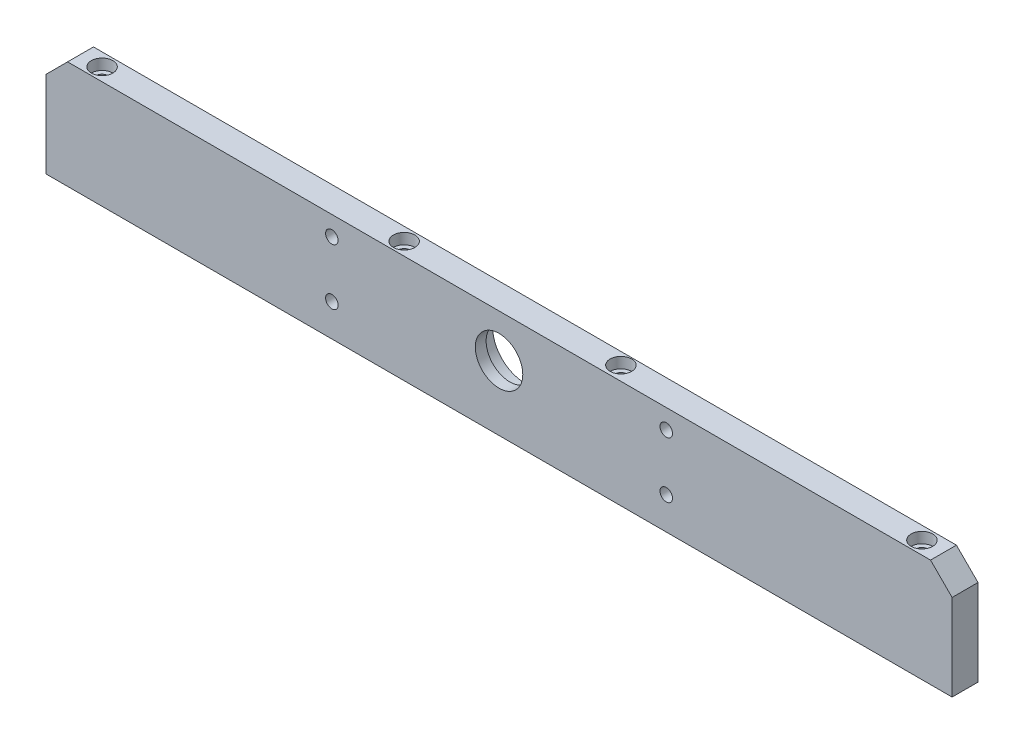
ISO-10303-21;
HEADER;
FILE_DESCRIPTION(('STEP AP214'),'2;1');
FILE_NAME('part.step','',(''),(''),'','','');
FILE_SCHEMA(('AUTOMOTIVE_DESIGN { 1 0 10303 214 1 1 1 1 }'));
ENDSEC;
DATA;
#1=APPLICATION_CONTEXT('core data for automotive mechanical design processes');
#2=APPLICATION_PROTOCOL_DEFINITION('international standard','automotive_design',2000,#1);
#3=PRODUCT_CONTEXT('',#1,'mechanical');
#4=PRODUCT('Part','Part','',(#3));
#5=PRODUCT_RELATED_PRODUCT_CATEGORY('part','',(#4));
#6=PRODUCT_DEFINITION_FORMATION('','',#4);
#7=PRODUCT_DEFINITION_CONTEXT('part definition',#1,'design');
#8=PRODUCT_DEFINITION('design','',#6,#7);
#9=PRODUCT_DEFINITION_SHAPE('','',#8);
#10=(LENGTH_UNIT() NAMED_UNIT(*) SI_UNIT(.MILLI.,.METRE.));
#11=(NAMED_UNIT(*) PLANE_ANGLE_UNIT() SI_UNIT($,.RADIAN.));
#12=(NAMED_UNIT(*) SI_UNIT($,.STERADIAN.) SOLID_ANGLE_UNIT());
#13=UNCERTAINTY_MEASURE_WITH_UNIT(LENGTH_MEASURE(1.E-05),#10,'distance_accuracy_value','');
#14=(GEOMETRIC_REPRESENTATION_CONTEXT(3) GLOBAL_UNCERTAINTY_ASSIGNED_CONTEXT((#13)) GLOBAL_UNIT_ASSIGNED_CONTEXT((#10,
#11,#12)) REPRESENTATION_CONTEXT('',''));
#15=CARTESIAN_POINT('',(0.,0.,0.));
#16=DIRECTION('',(0.,0.,1.));
#17=DIRECTION('',(1.,0.,0.));
#18=AXIS2_PLACEMENT_3D('',#15,#16,#17);
#19=CARTESIAN_POINT('',(210.,30.,0.));
#20=DIRECTION('',(0.,0.,1.));
#21=DIRECTION('',(1.,0.,0.));
#22=AXIS2_PLACEMENT_3D('',#19,#20,#21);
#23=CYLINDRICAL_SURFACE('',#22,11.);
#24=CARTESIAN_POINT('',(210.,30.,12.));
#25=DIRECTION('',(0.,0.,1.));
#26=DIRECTION('',(1.,0.,0.));
#27=AXIS2_PLACEMENT_3D('',#24,#25,#26);
#28=CIRCLE('',#27,11.);
#29=CARTESIAN_POINT('',(221.,30.,12.));
#30=VERTEX_POINT('',#29);
#31=EDGE_CURVE('E221',#30,#30,#28,.T.);
#32=ORIENTED_EDGE('',*,*,#31,.T.);
#33=EDGE_LOOP('',(#32));
#34=FACE_BOUND('',#33,.T.);
#35=CARTESIAN_POINT('',(210.,30.,7.));
#36=DIRECTION('',(0.,0.,-1.));
#37=DIRECTION('',(-1.,0.,0.));
#38=AXIS2_PLACEMENT_3D('',#35,#36,#37);
#39=CIRCLE('',#38,11.);
#40=CARTESIAN_POINT('',(199.,30.,7.));
#41=VERTEX_POINT('',#40);
#42=EDGE_CURVE('E41',#41,#41,#39,.F.);
#43=ORIENTED_EDGE('',*,*,#42,.F.);
#44=EDGE_LOOP('',(#43));
#45=FACE_BOUND('',#44,.T.);
#46=ADVANCED_FACE('F37',(#34,#45),#23,.F.);
#47=CARTESIAN_POINT('',(0.,0.,12.));
#48=DIRECTION('',(1.,0.,0.));
#49=DIRECTION('',(0.,0.,-1.));
#50=AXIS2_PLACEMENT_3D('',#47,#48,#49);
#51=PLANE('',#50);
#52=DIRECTION('',(0.,-1.,0.));
#53=VECTOR('',#52,1.);
#54=CARTESIAN_POINT('',(0.,0.,12.));
#55=LINE('',#54,#53);
#56=CARTESIAN_POINT('',(0.,40.,12.));
#57=VERTEX_POINT('',#56);
#58=CARTESIAN_POINT('',(0.,0.,12.));
#59=VERTEX_POINT('',#58);
#60=EDGE_CURVE('E225',#57,#59,#55,.T.);
#61=ORIENTED_EDGE('',*,*,#60,.F.);
#62=DIRECTION('',(0.,0.,-1.));
#63=VECTOR('',#62,1.);
#64=CARTESIAN_POINT('',(0.,40.,12.));
#65=LINE('',#64,#63);
#66=CARTESIAN_POINT('',(0.,40.,0.));
#67=VERTEX_POINT('',#66);
#68=EDGE_CURVE('E11',#57,#67,#65,.T.);
#69=ORIENTED_EDGE('',*,*,#68,.T.);
#70=DIRECTION('',(0.,-1.,0.));
#71=VECTOR('',#70,1.);
#72=CARTESIAN_POINT('',(0.,0.,0.));
#73=LINE('',#72,#71);
#74=CARTESIAN_POINT('',(0.,0.,0.));
#75=VERTEX_POINT('',#74);
#76=EDGE_CURVE('E224',#67,#75,#73,.T.);
#77=ORIENTED_EDGE('',*,*,#76,.T.);
#78=DIRECTION('',(0.,0.,-1.));
#79=VECTOR('',#78,1.);
#80=CARTESIAN_POINT('',(0.,0.,12.));
#81=LINE('',#80,#79);
#82=EDGE_CURVE('E244',#59,#75,#81,.T.);
#83=ORIENTED_EDGE('',*,*,#82,.F.);
#84=EDGE_LOOP('',(#61,#69,#77,#83));
#85=FACE_BOUND('',#84,.T.);
#86=ADVANCED_FACE('F280',(#85),#51,.F.);
#87=CARTESIAN_POINT('',(0.,0.,12.));
#88=DIRECTION('',(0.,1.,0.));
#89=DIRECTION('',(0.,0.,1.));
#90=AXIS2_PLACEMENT_3D('',#87,#88,#89);
#91=PLANE('',#90);
#92=CARTESIAN_POINT('',(20.,0.,6.));
#93=DIRECTION('',(0.,1.,0.));
#94=DIRECTION('',(0.,0.,1.));
#95=AXIS2_PLACEMENT_3D('',#92,#93,#94);
#96=CIRCLE('',#95,2.89999999999999);
#97=CARTESIAN_POINT('',(20.,0.,8.89999999999999));
#98=VERTEX_POINT('',#97);
#99=EDGE_CURVE('E176',#98,#98,#96,.T.);
#100=ORIENTED_EDGE('',*,*,#99,.T.);
#101=EDGE_LOOP('',(#100));
#102=FACE_BOUND('',#101,.T.);
#103=CARTESIAN_POINT('',(160.,0.,5.99999999999998));
#104=DIRECTION('',(0.,1.,0.));
#105=DIRECTION('',(0.,0.,1.));
#106=AXIS2_PLACEMENT_3D('',#103,#104,#105);
#107=CIRCLE('',#106,2.89999999999999);
#108=CARTESIAN_POINT('',(160.,0.,8.89999999999997));
#109=VERTEX_POINT('',#108);
#110=EDGE_CURVE('E188',#109,#109,#107,.T.);
#111=ORIENTED_EDGE('',*,*,#110,.T.);
#112=EDGE_LOOP('',(#111));
#113=FACE_BOUND('',#112,.T.);
#114=CARTESIAN_POINT('',(260.,0.,5.52848667820843));
#115=DIRECTION('',(0.,1.,0.));
#116=DIRECTION('',(0.,0.,1.));
#117=AXIS2_PLACEMENT_3D('',#114,#115,#116);
#118=CIRCLE('',#117,2.90000000000001);
#119=CARTESIAN_POINT('',(260.,0.,8.42848667820845));
#120=VERTEX_POINT('',#119);
#121=EDGE_CURVE('E200',#120,#120,#118,.T.);
#122=ORIENTED_EDGE('',*,*,#121,.T.);
#123=EDGE_LOOP('',(#122));
#124=FACE_BOUND('',#123,.T.);
#125=CARTESIAN_POINT('',(400.,0.,5.99999999999995));
#126=DIRECTION('',(0.,1.,0.));
#127=DIRECTION('',(0.,0.,1.));
#128=AXIS2_PLACEMENT_3D('',#125,#126,#127);
#129=CIRCLE('',#128,2.90000000000001);
#130=CARTESIAN_POINT('',(400.,0.,8.89999999999997));
#131=VERTEX_POINT('',#130);
#132=EDGE_CURVE('E212',#131,#131,#129,.T.);
#133=ORIENTED_EDGE('',*,*,#132,.T.);
#134=EDGE_LOOP('',(#133));
#135=FACE_BOUND('',#134,.T.);
#136=DIRECTION('',(1.,0.,0.));
#137=VECTOR('',#136,1.);
#138=CARTESIAN_POINT('',(0.,0.,0.));
#139=LINE('',#138,#137);
#140=CARTESIAN_POINT('',(420.,0.,0.));
#141=VERTEX_POINT('',#140);
#142=EDGE_CURVE('E236',#75,#141,#139,.T.);
#143=ORIENTED_EDGE('',*,*,#142,.T.);
#144=DIRECTION('',(0.,0.,-1.));
#145=VECTOR('',#144,1.);
#146=CARTESIAN_POINT('',(420.,0.,12.));
#147=LINE('',#146,#145);
#148=CARTESIAN_POINT('',(420.,0.,12.));
#149=VERTEX_POINT('',#148);
#150=EDGE_CURVE('E234',#149,#141,#147,.T.);
#151=ORIENTED_EDGE('',*,*,#150,.F.);
#152=DIRECTION('',(1.,0.,0.));
#153=VECTOR('',#152,1.);
#154=CARTESIAN_POINT('',(0.,0.,12.));
#155=LINE('',#154,#153);
#156=EDGE_CURVE('E227',#59,#149,#155,.T.);
#157=ORIENTED_EDGE('',*,*,#156,.F.);
#158=ORIENTED_EDGE('',*,*,#82,.T.);
#159=EDGE_LOOP('',(#143,#151,#157,#158));
#160=FACE_BOUND('',#159,.T.);
#161=ADVANCED_FACE('F276',(#102,#113,#124,#135,#160),#91,.F.);
#162=CARTESIAN_POINT('',(420.,0.,12.));
#163=DIRECTION('',(-1.,0.,0.));
#164=DIRECTION('',(0.,0.,1.));
#165=AXIS2_PLACEMENT_3D('',#162,#163,#164);
#166=PLANE('',#165);
#167=DIRECTION('',(0.,1.,0.));
#168=VECTOR('',#167,1.);
#169=CARTESIAN_POINT('',(420.,0.,0.));
#170=LINE('',#169,#168);
#171=CARTESIAN_POINT('',(420.,39.9999999999999,0.));
#172=VERTEX_POINT('',#171);
#173=EDGE_CURVE('E238',#141,#172,#170,.T.);
#174=ORIENTED_EDGE('',*,*,#173,.T.);
#175=DIRECTION('',(0.,0.,1.));
#176=VECTOR('',#175,1.);
#177=CARTESIAN_POINT('',(420.,39.9999999999999,12.));
#178=LINE('',#177,#176);
#179=CARTESIAN_POINT('',(420.,39.9999999999999,12.));
#180=VERTEX_POINT('',#179);
#181=EDGE_CURVE('E61',#172,#180,#178,.T.);
#182=ORIENTED_EDGE('',*,*,#181,.T.);
#183=DIRECTION('',(0.,1.,0.));
#184=VECTOR('',#183,1.);
#185=CARTESIAN_POINT('',(420.,0.,12.));
#186=LINE('',#185,#184);
#187=EDGE_CURVE('E230',#149,#180,#186,.T.);
#188=ORIENTED_EDGE('',*,*,#187,.F.);
#189=ORIENTED_EDGE('',*,*,#150,.T.);
#190=EDGE_LOOP('',(#174,#182,#188,#189));
#191=FACE_BOUND('',#190,.T.);
#192=ADVANCED_FACE('F272',(#191),#166,.F.);
#193=CARTESIAN_POINT('',(0.,50.,12.));
#194=DIRECTION('',(0.,-1.,0.));
#195=DIRECTION('',(0.,0.,-1.));
#196=AXIS2_PLACEMENT_3D('',#193,#194,#195);
#197=PLANE('',#196);
#198=CARTESIAN_POINT('',(20.,50.,6.));
#199=DIRECTION('',(0.,1.,0.));
#200=DIRECTION('',(0.,0.,1.));
#201=AXIS2_PLACEMENT_3D('',#198,#199,#200);
#202=CIRCLE('',#201,5.);
#203=CARTESIAN_POINT('',(20.,50.,11.));
#204=VERTEX_POINT('',#203);
#205=EDGE_CURVE('E167',#204,#204,#202,.T.);
#206=ORIENTED_EDGE('',*,*,#205,.F.);
#207=EDGE_LOOP('',(#206));
#208=FACE_BOUND('',#207,.T.);
#209=CARTESIAN_POINT('',(160.,50.,5.99999999999998));
#210=DIRECTION('',(0.,1.,0.));
#211=DIRECTION('',(0.,0.,1.));
#212=AXIS2_PLACEMENT_3D('',#209,#210,#211);
#213=CIRCLE('',#212,5.);
#214=CARTESIAN_POINT('',(160.,50.,11.));
#215=VERTEX_POINT('',#214);
#216=EDGE_CURVE('E179',#215,#215,#213,.T.);
#217=ORIENTED_EDGE('',*,*,#216,.F.);
#218=EDGE_LOOP('',(#217));
#219=FACE_BOUND('',#218,.T.);
#220=CARTESIAN_POINT('',(260.,50.,5.52848667820843));
#221=DIRECTION('',(0.,1.,0.));
#222=DIRECTION('',(0.,0.,1.));
#223=AXIS2_PLACEMENT_3D('',#220,#221,#222);
#224=CIRCLE('',#223,5.);
#225=CARTESIAN_POINT('',(260.,50.,10.5284866782084));
#226=VERTEX_POINT('',#225);
#227=EDGE_CURVE('E191',#226,#226,#224,.T.);
#228=ORIENTED_EDGE('',*,*,#227,.F.);
#229=EDGE_LOOP('',(#228));
#230=FACE_BOUND('',#229,.T.);
#231=CARTESIAN_POINT('',(400.,50.,5.99999999999995));
#232=DIRECTION('',(0.,1.,0.));
#233=DIRECTION('',(0.,0.,1.));
#234=AXIS2_PLACEMENT_3D('',#231,#232,#233);
#235=CIRCLE('',#234,5.);
#236=CARTESIAN_POINT('',(400.,50.,11.));
#237=VERTEX_POINT('',#236);
#238=EDGE_CURVE('E203',#237,#237,#235,.T.);
#239=ORIENTED_EDGE('',*,*,#238,.F.);
#240=EDGE_LOOP('',(#239));
#241=FACE_BOUND('',#240,.T.);
#242=DIRECTION('',(-1.,0.,0.));
#243=VECTOR('',#242,1.);
#244=CARTESIAN_POINT('',(0.,50.,12.));
#245=LINE('',#244,#243);
#246=CARTESIAN_POINT('',(410.,50.,12.));
#247=VERTEX_POINT('',#246);
#248=CARTESIAN_POINT('',(10.,50.,12.));
#249=VERTEX_POINT('',#248);
#250=EDGE_CURVE('E232',#247,#249,#245,.T.);
#251=ORIENTED_EDGE('',*,*,#250,.F.);
#252=DIRECTION('',(0.,0.,-1.));
#253=VECTOR('',#252,1.);
#254=CARTESIAN_POINT('',(410.,50.,12.));
#255=LINE('',#254,#253);
#256=CARTESIAN_POINT('',(410.,50.,0.));
#257=VERTEX_POINT('',#256);
#258=EDGE_CURVE('E249',#247,#257,#255,.T.);
#259=ORIENTED_EDGE('',*,*,#258,.T.);
#260=DIRECTION('',(-1.,0.,0.));
#261=VECTOR('',#260,1.);
#262=CARTESIAN_POINT('',(0.,50.,0.));
#263=LINE('',#262,#261);
#264=CARTESIAN_POINT('',(10.,50.,0.));
#265=VERTEX_POINT('',#264);
#266=EDGE_CURVE('E228',#257,#265,#263,.T.);
#267=ORIENTED_EDGE('',*,*,#266,.T.);
#268=DIRECTION('',(0.,0.,1.));
#269=VECTOR('',#268,1.);
#270=CARTESIAN_POINT('',(10.,50.,12.));
#271=LINE('',#270,#269);
#272=EDGE_CURVE('E247',#265,#249,#271,.T.);
#273=ORIENTED_EDGE('',*,*,#272,.T.);
#274=EDGE_LOOP('',(#251,#259,#267,#273));
#275=FACE_BOUND('',#274,.T.);
#276=ADVANCED_FACE('F264',(#208,#219,#230,#241,#275),#197,.F.);
#277=CARTESIAN_POINT('',(0.,50.,12.));
#278=DIRECTION('',(0.,0.,-1.));
#279=DIRECTION('',(-1.,0.,0.));
#280=AXIS2_PLACEMENT_3D('',#277,#278,#279);
#281=PLANE('',#280);
#282=CARTESIAN_POINT('',(287.5,40.9999999999999,12.));
#283=DIRECTION('',(0.,0.,-1.));
#284=DIRECTION('',(-1.,0.,0.));
#285=AXIS2_PLACEMENT_3D('',#282,#283,#284);
#286=CIRCLE('',#285,2.90000000000001);
#287=CARTESIAN_POINT('',(284.6,40.9999999999999,12.));
#288=VERTEX_POINT('',#287);
#289=EDGE_CURVE('E128',#288,#288,#286,.T.);
#290=ORIENTED_EDGE('',*,*,#289,.T.);
#291=EDGE_LOOP('',(#290));
#292=FACE_BOUND('',#291,.T.);
#293=CARTESIAN_POINT('',(287.5,15.,12.));
#294=DIRECTION('',(0.,0.,-1.));
#295=DIRECTION('',(-1.,0.,0.));
#296=AXIS2_PLACEMENT_3D('',#293,#294,#295);
#297=CIRCLE('',#296,2.90000000000001);
#298=CARTESIAN_POINT('',(284.6,15.,12.));
#299=VERTEX_POINT('',#298);
#300=EDGE_CURVE('E140',#299,#299,#297,.T.);
#301=ORIENTED_EDGE('',*,*,#300,.T.);
#302=EDGE_LOOP('',(#301));
#303=FACE_BOUND('',#302,.T.);
#304=CARTESIAN_POINT('',(132.5,40.9999999999999,12.));
#305=DIRECTION('',(0.,0.,-1.));
#306=DIRECTION('',(-1.,0.,0.));
#307=AXIS2_PLACEMENT_3D('',#304,#305,#306);
#308=CIRCLE('',#307,2.89999999999999);
#309=CARTESIAN_POINT('',(129.6,40.9999999999999,12.));
#310=VERTEX_POINT('',#309);
#311=EDGE_CURVE('E152',#310,#310,#308,.T.);
#312=ORIENTED_EDGE('',*,*,#311,.T.);
#313=EDGE_LOOP('',(#312));
#314=FACE_BOUND('',#313,.T.);
#315=CARTESIAN_POINT('',(132.5,15.,12.));
#316=DIRECTION('',(0.,0.,-1.));
#317=DIRECTION('',(-1.,0.,0.));
#318=AXIS2_PLACEMENT_3D('',#315,#316,#317);
#319=CIRCLE('',#318,2.89999999999999);
#320=CARTESIAN_POINT('',(129.6,15.,12.));
#321=VERTEX_POINT('',#320);
#322=EDGE_CURVE('E164',#321,#321,#319,.T.);
#323=ORIENTED_EDGE('',*,*,#322,.T.);
#324=EDGE_LOOP('',(#323));
#325=FACE_BOUND('',#324,.T.);
#326=ORIENTED_EDGE('',*,*,#31,.F.);
#327=EDGE_LOOP('',(#326));
#328=FACE_BOUND('',#327,.T.);
#329=ORIENTED_EDGE('',*,*,#187,.T.);
#330=DIRECTION('',(0.707106781186546,-0.707106781186549,0.));
#331=VECTOR('',#330,1.);
#332=CARTESIAN_POINT('',(410.,50.,12.));
#333=LINE('',#332,#331);
#334=EDGE_CURVE('E46',#180,#247,#333,.F.);
#335=ORIENTED_EDGE('',*,*,#334,.T.);
#336=ORIENTED_EDGE('',*,*,#250,.T.);
#337=DIRECTION('',(0.707106781186549,0.707106781186546,0.));
#338=VECTOR('',#337,1.);
#339=CARTESIAN_POINT('',(0.,40.,12.));
#340=LINE('',#339,#338);
#341=EDGE_CURVE('E53',#249,#57,#340,.F.);
#342=ORIENTED_EDGE('',*,*,#341,.T.);
#343=ORIENTED_EDGE('',*,*,#60,.T.);
#344=ORIENTED_EDGE('',*,*,#156,.T.);
#345=EDGE_LOOP('',(#329,#335,#336,#342,#343,#344));
#346=FACE_BOUND('',#345,.T.);
#347=ADVANCED_FACE('F260',(#292,#303,#314,#325,#328,#346),#281,.F.);
#348=CARTESIAN_POINT('',(0.,50.,0.));
#349=DIRECTION('',(0.,0.,-1.));
#350=DIRECTION('',(-1.,0.,0.));
#351=AXIS2_PLACEMENT_3D('',#348,#349,#350);
#352=PLANE('',#351);
#353=CARTESIAN_POINT('',(243.,25.5,0.));
#354=DIRECTION('',(0.,0.,-1.));
#355=DIRECTION('',(-1.,0.,0.));
#356=AXIS2_PLACEMENT_3D('',#353,#354,#355);
#357=CIRCLE('',#356,1.64999999999998);
#358=CARTESIAN_POINT('',(241.35,25.5,0.));
#359=VERTEX_POINT('',#358);
#360=EDGE_CURVE('E109',#359,#359,#357,.T.);
#361=ORIENTED_EDGE('',*,*,#360,.F.);
#362=EDGE_LOOP('',(#361));
#363=FACE_BOUND('',#362,.T.);
#364=CARTESIAN_POINT('',(243.,10.5,0.));
#365=DIRECTION('',(0.,0.,-1.));
#366=DIRECTION('',(-1.,0.,0.));
#367=AXIS2_PLACEMENT_3D('',#364,#365,#366);
#368=CIRCLE('',#367,1.64999999999998);
#369=CARTESIAN_POINT('',(241.35,10.5,0.));
#370=VERTEX_POINT('',#369);
#371=EDGE_CURVE('E108',#370,#370,#368,.T.);
#372=ORIENTED_EDGE('',*,*,#371,.F.);
#373=EDGE_LOOP('',(#372));
#374=FACE_BOUND('',#373,.T.);
#375=CARTESIAN_POINT('',(287.5,40.9999999999999,0.));
#376=DIRECTION('',(0.,0.,-1.));
#377=DIRECTION('',(-1.,0.,0.));
#378=AXIS2_PLACEMENT_3D('',#375,#376,#377);
#379=CIRCLE('',#378,5.);
#380=CARTESIAN_POINT('',(282.5,40.9999999999999,0.));
#381=VERTEX_POINT('',#380);
#382=EDGE_CURVE('E119',#381,#381,#379,.T.);
#383=ORIENTED_EDGE('',*,*,#382,.F.);
#384=EDGE_LOOP('',(#383));
#385=FACE_BOUND('',#384,.T.);
#386=CARTESIAN_POINT('',(287.5,15.,0.));
#387=DIRECTION('',(0.,0.,-1.));
#388=DIRECTION('',(-1.,0.,0.));
#389=AXIS2_PLACEMENT_3D('',#386,#387,#388);
#390=CIRCLE('',#389,5.);
#391=CARTESIAN_POINT('',(282.5,15.,0.));
#392=VERTEX_POINT('',#391);
#393=EDGE_CURVE('E131',#392,#392,#390,.T.);
#394=ORIENTED_EDGE('',*,*,#393,.F.);
#395=EDGE_LOOP('',(#394));
#396=FACE_BOUND('',#395,.T.);
#397=CARTESIAN_POINT('',(132.5,40.9999999999999,0.));
#398=DIRECTION('',(0.,0.,-1.));
#399=DIRECTION('',(-1.,0.,0.));
#400=AXIS2_PLACEMENT_3D('',#397,#398,#399);
#401=CIRCLE('',#400,5.);
#402=CARTESIAN_POINT('',(127.5,40.9999999999999,0.));
#403=VERTEX_POINT('',#402);
#404=EDGE_CURVE('E143',#403,#403,#401,.T.);
#405=ORIENTED_EDGE('',*,*,#404,.F.);
#406=EDGE_LOOP('',(#405));
#407=FACE_BOUND('',#406,.T.);
#408=CARTESIAN_POINT('',(132.5,15.,0.));
#409=DIRECTION('',(0.,0.,-1.));
#410=DIRECTION('',(-1.,0.,0.));
#411=AXIS2_PLACEMENT_3D('',#408,#409,#410);
#412=CIRCLE('',#411,5.);
#413=CARTESIAN_POINT('',(127.5,15.,0.));
#414=VERTEX_POINT('',#413);
#415=EDGE_CURVE('E155',#414,#414,#412,.T.);
#416=ORIENTED_EDGE('',*,*,#415,.F.);
#417=EDGE_LOOP('',(#416));
#418=FACE_BOUND('',#417,.T.);
#419=CARTESIAN_POINT('',(210.,30.,0.));
#420=DIRECTION('',(0.,0.,-1.));
#421=DIRECTION('',(-1.,0.,0.));
#422=AXIS2_PLACEMENT_3D('',#419,#420,#421);
#423=CIRCLE('',#422,15.);
#424=CARTESIAN_POINT('',(195.,30.,0.));
#425=VERTEX_POINT('',#424);
#426=EDGE_CURVE('E215',#425,#425,#423,.T.);
#427=ORIENTED_EDGE('',*,*,#426,.F.);
#428=EDGE_LOOP('',(#427));
#429=FACE_BOUND('',#428,.T.);
#430=ORIENTED_EDGE('',*,*,#266,.F.);
#431=DIRECTION('',(-0.707106781186546,0.707106781186549,0.));
#432=VECTOR('',#431,1.);
#433=CARTESIAN_POINT('',(205.000000000001,255.,0.));
#434=LINE('',#433,#432);
#435=EDGE_CURVE('E254',#257,#172,#434,.F.);
#436=ORIENTED_EDGE('',*,*,#435,.T.);
#437=ORIENTED_EDGE('',*,*,#173,.F.);
#438=ORIENTED_EDGE('',*,*,#142,.F.);
#439=ORIENTED_EDGE('',*,*,#76,.F.);
#440=DIRECTION('',(-0.707106781186549,-0.707106781186546,0.));
#441=VECTOR('',#440,1.);
#442=CARTESIAN_POINT('',(4.99999999999998,45.,0.));
#443=LINE('',#442,#441);
#444=EDGE_CURVE('E252',#67,#265,#443,.F.);
#445=ORIENTED_EDGE('',*,*,#444,.T.);
#446=EDGE_LOOP('',(#430,#436,#437,#438,#439,#445));
#447=FACE_BOUND('',#446,.T.);
#448=ADVANCED_FACE('F270',(#363,#374,#385,#396,#407,#418,#429,#447),#352,.T.);
#449=CARTESIAN_POINT('',(410.,50.,12.));
#450=DIRECTION('',(-0.707106781186549,-0.707106781186545,0.));
#451=DIRECTION('',(0.707106781186546,-0.707106781186549,0.));
#452=AXIS2_PLACEMENT_3D('',#449,#450,#451);
#453=PLANE('',#452);
#454=ORIENTED_EDGE('',*,*,#334,.F.);
#455=ORIENTED_EDGE('',*,*,#181,.F.);
#456=ORIENTED_EDGE('',*,*,#435,.F.);
#457=ORIENTED_EDGE('',*,*,#258,.F.);
#458=EDGE_LOOP('',(#454,#455,#456,#457));
#459=FACE_BOUND('',#458,.T.);
#460=ADVANCED_FACE('F267',(#459),#453,.F.);
#461=CARTESIAN_POINT('',(0.,40.,12.));
#462=DIRECTION('',(0.707106781186546,-0.707106781186549,0.));
#463=DIRECTION('',(0.707106781186549,0.707106781186546,0.));
#464=AXIS2_PLACEMENT_3D('',#461,#462,#463);
#465=PLANE('',#464);
#466=ORIENTED_EDGE('',*,*,#341,.F.);
#467=ORIENTED_EDGE('',*,*,#272,.F.);
#468=ORIENTED_EDGE('',*,*,#444,.F.);
#469=ORIENTED_EDGE('',*,*,#68,.F.);
#470=EDGE_LOOP('',(#466,#467,#468,#469));
#471=FACE_BOUND('',#470,.T.);
#472=ADVANCED_FACE('F39',(#471),#465,.F.);
#473=CARTESIAN_POINT('',(210.,30.,7.));
#474=DIRECTION('',(0.,0.,-1.));
#475=DIRECTION('',(-1.,0.,0.));
#476=AXIS2_PLACEMENT_3D('',#473,#474,#475);
#477=PLANE('',#476);
#478=CARTESIAN_POINT('',(210.,30.,7.));
#479=DIRECTION('',(0.,0.,-1.));
#480=DIRECTION('',(-1.,0.,0.));
#481=AXIS2_PLACEMENT_3D('',#478,#479,#480);
#482=CIRCLE('',#481,15.);
#483=CARTESIAN_POINT('',(195.,30.,7.));
#484=VERTEX_POINT('',#483);
#485=EDGE_CURVE('E216',#484,#484,#482,.T.);
#486=ORIENTED_EDGE('',*,*,#485,.T.);
#487=EDGE_LOOP('',(#486));
#488=FACE_BOUND('',#487,.T.);
#489=ORIENTED_EDGE('',*,*,#42,.T.);
#490=EDGE_LOOP('',(#489));
#491=FACE_BOUND('',#490,.T.);
#492=ADVANCED_FACE('F284',(#488,#491),#477,.T.);
#493=CARTESIAN_POINT('',(210.,30.,7.));
#494=DIRECTION('',(0.,0.,-1.));
#495=DIRECTION('',(-1.,0.,0.));
#496=AXIS2_PLACEMENT_3D('',#493,#494,#495);
#497=CYLINDRICAL_SURFACE('',#496,15.);
#498=ORIENTED_EDGE('',*,*,#485,.F.);
#499=EDGE_LOOP('',(#498));
#500=FACE_BOUND('',#499,.T.);
#501=ORIENTED_EDGE('',*,*,#426,.T.);
#502=EDGE_LOOP('',(#501));
#503=FACE_BOUND('',#502,.T.);
#504=ADVANCED_FACE('F289',(#500,#503),#497,.F.);
#505=CARTESIAN_POINT('',(400.,50.,5.99999999999995));
#506=DIRECTION('',(0.,1.,0.));
#507=DIRECTION('',(0.,0.,1.));
#508=AXIS2_PLACEMENT_3D('',#505,#506,#507);
#509=CYLINDRICAL_SURFACE('',#508,2.90000000000001);
#510=ORIENTED_EDGE('',*,*,#132,.F.);
#511=EDGE_LOOP('',(#510));
#512=FACE_BOUND('',#511,.T.);
#513=CARTESIAN_POINT('',(400.,45.,5.99999999999995));
#514=DIRECTION('',(0.,1.,0.));
#515=DIRECTION('',(0.,0.,1.));
#516=AXIS2_PLACEMENT_3D('',#513,#514,#515);
#517=CIRCLE('',#516,2.90000000000001);
#518=CARTESIAN_POINT('',(400.,45.,8.89999999999997));
#519=VERTEX_POINT('',#518);
#520=EDGE_CURVE('E209',#519,#519,#517,.T.);
#521=ORIENTED_EDGE('',*,*,#520,.T.);
#522=EDGE_LOOP('',(#521));
#523=FACE_BOUND('',#522,.T.);
#524=ADVANCED_FACE('F326',(#512,#523),#509,.F.);
#525=CARTESIAN_POINT('',(402.9,45.,5.99999999999995));
#526=DIRECTION('',(0.,-1.,0.));
#527=DIRECTION('',(0.,0.,-1.));
#528=AXIS2_PLACEMENT_3D('',#525,#526,#527);
#529=PLANE('',#528);
#530=ORIENTED_EDGE('',*,*,#520,.F.);
#531=EDGE_LOOP('',(#530));
#532=FACE_BOUND('',#531,.T.);
#533=CARTESIAN_POINT('',(400.,45.,5.99999999999995));
#534=DIRECTION('',(0.,1.,0.));
#535=DIRECTION('',(0.,0.,1.));
#536=AXIS2_PLACEMENT_3D('',#533,#534,#535);
#537=CIRCLE('',#536,5.);
#538=CARTESIAN_POINT('',(400.,45.,11.));
#539=VERTEX_POINT('',#538);
#540=EDGE_CURVE('E206',#539,#539,#537,.T.);
#541=ORIENTED_EDGE('',*,*,#540,.T.);
#542=EDGE_LOOP('',(#541));
#543=FACE_BOUND('',#542,.T.);
#544=ADVANCED_FACE('F329',(#532,#543),#529,.F.);
#545=CARTESIAN_POINT('',(400.,50.,5.99999999999995));
#546=DIRECTION('',(0.,1.,0.));
#547=DIRECTION('',(0.,0.,1.));
#548=AXIS2_PLACEMENT_3D('',#545,#546,#547);
#549=CYLINDRICAL_SURFACE('',#548,5.);
#550=ORIENTED_EDGE('',*,*,#540,.F.);
#551=EDGE_LOOP('',(#550));
#552=FACE_BOUND('',#551,.T.);
#553=ORIENTED_EDGE('',*,*,#238,.T.);
#554=EDGE_LOOP('',(#553));
#555=FACE_BOUND('',#554,.T.);
#556=ADVANCED_FACE('F335',(#552,#555),#549,.F.);
#557=CARTESIAN_POINT('',(260.,50.,5.52848667820843));
#558=DIRECTION('',(0.,1.,0.));
#559=DIRECTION('',(0.,0.,1.));
#560=AXIS2_PLACEMENT_3D('',#557,#558,#559);
#561=CYLINDRICAL_SURFACE('',#560,2.90000000000001);
#562=ORIENTED_EDGE('',*,*,#121,.F.);
#563=EDGE_LOOP('',(#562));
#564=FACE_BOUND('',#563,.T.);
#565=CARTESIAN_POINT('',(260.,45.,5.52848667820843));
#566=DIRECTION('',(0.,1.,0.));
#567=DIRECTION('',(0.,0.,1.));
#568=AXIS2_PLACEMENT_3D('',#565,#566,#567);
#569=CIRCLE('',#568,2.90000000000001);
#570=CARTESIAN_POINT('',(260.,45.,8.42848667820845));
#571=VERTEX_POINT('',#570);
#572=EDGE_CURVE('E197',#571,#571,#569,.T.);
#573=ORIENTED_EDGE('',*,*,#572,.T.);
#574=EDGE_LOOP('',(#573));
#575=FACE_BOUND('',#574,.T.);
#576=ADVANCED_FACE('F341',(#564,#575),#561,.F.);
#577=CARTESIAN_POINT('',(262.9,45.,5.52848667820843));
#578=DIRECTION('',(0.,-1.,0.));
#579=DIRECTION('',(0.,0.,-1.));
#580=AXIS2_PLACEMENT_3D('',#577,#578,#579);
#581=PLANE('',#580);
#582=ORIENTED_EDGE('',*,*,#572,.F.);
#583=EDGE_LOOP('',(#582));
#584=FACE_BOUND('',#583,.T.);
#585=CARTESIAN_POINT('',(260.,45.,5.52848667820843));
#586=DIRECTION('',(0.,1.,0.));
#587=DIRECTION('',(0.,0.,1.));
#588=AXIS2_PLACEMENT_3D('',#585,#586,#587);
#589=CIRCLE('',#588,5.);
#590=CARTESIAN_POINT('',(260.,45.,10.5284866782084));
#591=VERTEX_POINT('',#590);
#592=EDGE_CURVE('E194',#591,#591,#589,.T.);
#593=ORIENTED_EDGE('',*,*,#592,.T.);
#594=EDGE_LOOP('',(#593));
#595=FACE_BOUND('',#594,.T.);
#596=ADVANCED_FACE('F348',(#584,#595),#581,.F.);
#597=CARTESIAN_POINT('',(260.,50.,5.52848667820843));
#598=DIRECTION('',(0.,1.,0.));
#599=DIRECTION('',(0.,0.,1.));
#600=AXIS2_PLACEMENT_3D('',#597,#598,#599);
#601=CYLINDRICAL_SURFACE('',#600,5.);
#602=ORIENTED_EDGE('',*,*,#592,.F.);
#603=EDGE_LOOP('',(#602));
#604=FACE_BOUND('',#603,.T.);
#605=ORIENTED_EDGE('',*,*,#227,.T.);
#606=EDGE_LOOP('',(#605));
#607=FACE_BOUND('',#606,.T.);
#608=ADVANCED_FACE('F354',(#604,#607),#601,.F.);
#609=CARTESIAN_POINT('',(160.,50.,5.99999999999998));
#610=DIRECTION('',(0.,1.,0.));
#611=DIRECTION('',(0.,0.,1.));
#612=AXIS2_PLACEMENT_3D('',#609,#610,#611);
#613=CYLINDRICAL_SURFACE('',#612,2.9);
#614=ORIENTED_EDGE('',*,*,#110,.F.);
#615=EDGE_LOOP('',(#614));
#616=FACE_BOUND('',#615,.T.);
#617=CARTESIAN_POINT('',(160.,45.,5.99999999999998));
#618=DIRECTION('',(0.,1.,0.));
#619=DIRECTION('',(0.,0.,1.));
#620=AXIS2_PLACEMENT_3D('',#617,#618,#619);
#621=CIRCLE('',#620,2.90000000000001);
#622=CARTESIAN_POINT('',(160.,45.,8.9));
#623=VERTEX_POINT('',#622);
#624=EDGE_CURVE('E185',#623,#623,#621,.T.);
#625=ORIENTED_EDGE('',*,*,#624,.T.);
#626=EDGE_LOOP('',(#625));
#627=FACE_BOUND('',#626,.T.);
#628=ADVANCED_FACE('F358',(#616,#627),#613,.F.);
#629=CARTESIAN_POINT('',(162.9,45.,5.99999999999998));
#630=DIRECTION('',(0.,-1.,0.));
#631=DIRECTION('',(0.,0.,-1.));
#632=AXIS2_PLACEMENT_3D('',#629,#630,#631);
#633=PLANE('',#632);
#634=ORIENTED_EDGE('',*,*,#624,.F.);
#635=EDGE_LOOP('',(#634));
#636=FACE_BOUND('',#635,.T.);
#637=CARTESIAN_POINT('',(160.,45.,5.99999999999998));
#638=DIRECTION('',(0.,1.,0.));
#639=DIRECTION('',(0.,0.,1.));
#640=AXIS2_PLACEMENT_3D('',#637,#638,#639);
#641=CIRCLE('',#640,5.);
#642=CARTESIAN_POINT('',(160.,45.,11.));
#643=VERTEX_POINT('',#642);
#644=EDGE_CURVE('E182',#643,#643,#641,.T.);
#645=ORIENTED_EDGE('',*,*,#644,.T.);
#646=EDGE_LOOP('',(#645));
#647=FACE_BOUND('',#646,.T.);
#648=ADVANCED_FACE('F362',(#636,#647),#633,.F.);
#649=CARTESIAN_POINT('',(160.,50.,5.99999999999998));
#650=DIRECTION('',(0.,1.,0.));
#651=DIRECTION('',(0.,0.,1.));
#652=AXIS2_PLACEMENT_3D('',#649,#650,#651);
#653=CYLINDRICAL_SURFACE('',#652,5.);
#654=ORIENTED_EDGE('',*,*,#644,.F.);
#655=EDGE_LOOP('',(#654));
#656=FACE_BOUND('',#655,.T.);
#657=ORIENTED_EDGE('',*,*,#216,.T.);
#658=EDGE_LOOP('',(#657));
#659=FACE_BOUND('',#658,.T.);
#660=ADVANCED_FACE('F366',(#656,#659),#653,.F.);
#661=CARTESIAN_POINT('',(20.,50.,6.));
#662=DIRECTION('',(0.,1.,0.));
#663=DIRECTION('',(0.,0.,1.));
#664=AXIS2_PLACEMENT_3D('',#661,#662,#663);
#665=CYLINDRICAL_SURFACE('',#664,2.9);
#666=ORIENTED_EDGE('',*,*,#99,.F.);
#667=EDGE_LOOP('',(#666));
#668=FACE_BOUND('',#667,.T.);
#669=CARTESIAN_POINT('',(20.,45.,6.));
#670=DIRECTION('',(0.,1.,0.));
#671=DIRECTION('',(0.,0.,1.));
#672=AXIS2_PLACEMENT_3D('',#669,#670,#671);
#673=CIRCLE('',#672,2.9);
#674=CARTESIAN_POINT('',(20.,45.,8.9));
#675=VERTEX_POINT('',#674);
#676=EDGE_CURVE('E173',#675,#675,#673,.T.);
#677=ORIENTED_EDGE('',*,*,#676,.T.);
#678=EDGE_LOOP('',(#677));
#679=FACE_BOUND('',#678,.T.);
#680=ADVANCED_FACE('F370',(#668,#679),#665,.F.);
#681=CARTESIAN_POINT('',(22.9,45.,6.));
#682=DIRECTION('',(0.,-1.,0.));
#683=DIRECTION('',(0.,0.,-1.));
#684=AXIS2_PLACEMENT_3D('',#681,#682,#683);
#685=PLANE('',#684);
#686=ORIENTED_EDGE('',*,*,#676,.F.);
#687=EDGE_LOOP('',(#686));
#688=FACE_BOUND('',#687,.T.);
#689=CARTESIAN_POINT('',(20.,45.,6.));
#690=DIRECTION('',(0.,1.,0.));
#691=DIRECTION('',(0.,0.,1.));
#692=AXIS2_PLACEMENT_3D('',#689,#690,#691);
#693=CIRCLE('',#692,5.);
#694=CARTESIAN_POINT('',(20.,45.,11.));
#695=VERTEX_POINT('',#694);
#696=EDGE_CURVE('E170',#695,#695,#693,.T.);
#697=ORIENTED_EDGE('',*,*,#696,.T.);
#698=EDGE_LOOP('',(#697));
#699=FACE_BOUND('',#698,.T.);
#700=ADVANCED_FACE('F374',(#688,#699),#685,.F.);
#701=CARTESIAN_POINT('',(20.,50.,6.));
#702=DIRECTION('',(0.,1.,0.));
#703=DIRECTION('',(0.,0.,1.));
#704=AXIS2_PLACEMENT_3D('',#701,#702,#703);
#705=CYLINDRICAL_SURFACE('',#704,5.);
#706=ORIENTED_EDGE('',*,*,#696,.F.);
#707=EDGE_LOOP('',(#706));
#708=FACE_BOUND('',#707,.T.);
#709=ORIENTED_EDGE('',*,*,#205,.T.);
#710=EDGE_LOOP('',(#709));
#711=FACE_BOUND('',#710,.T.);
#712=ADVANCED_FACE('F378',(#708,#711),#705,.F.);
#713=CARTESIAN_POINT('',(132.5,15.,0.));
#714=DIRECTION('',(0.,0.,-1.));
#715=DIRECTION('',(-1.,0.,0.));
#716=AXIS2_PLACEMENT_3D('',#713,#714,#715);
#717=CYLINDRICAL_SURFACE('',#716,2.9);
#718=ORIENTED_EDGE('',*,*,#322,.F.);
#719=EDGE_LOOP('',(#718));
#720=FACE_BOUND('',#719,.T.);
#721=CARTESIAN_POINT('',(132.5,15.,5.));
#722=DIRECTION('',(0.,0.,-1.));
#723=DIRECTION('',(-1.,0.,0.));
#724=AXIS2_PLACEMENT_3D('',#721,#722,#723);
#725=CIRCLE('',#724,2.90000000000001);
#726=CARTESIAN_POINT('',(129.6,15.,5.));
#727=VERTEX_POINT('',#726);
#728=EDGE_CURVE('E161',#727,#727,#725,.T.);
#729=ORIENTED_EDGE('',*,*,#728,.T.);
#730=EDGE_LOOP('',(#729));
#731=FACE_BOUND('',#730,.T.);
#732=ADVANCED_FACE('F382',(#720,#731),#717,.F.);
#733=CARTESIAN_POINT('',(135.4,15.,5.));
#734=DIRECTION('',(0.,0.,1.));
#735=DIRECTION('',(1.,0.,0.));
#736=AXIS2_PLACEMENT_3D('',#733,#734,#735);
#737=PLANE('',#736);
#738=ORIENTED_EDGE('',*,*,#728,.F.);
#739=EDGE_LOOP('',(#738));
#740=FACE_BOUND('',#739,.T.);
#741=CARTESIAN_POINT('',(132.5,15.,5.));
#742=DIRECTION('',(0.,0.,-1.));
#743=DIRECTION('',(-1.,0.,0.));
#744=AXIS2_PLACEMENT_3D('',#741,#742,#743);
#745=CIRCLE('',#744,5.);
#746=CARTESIAN_POINT('',(127.5,15.,5.));
#747=VERTEX_POINT('',#746);
#748=EDGE_CURVE('E158',#747,#747,#745,.T.);
#749=ORIENTED_EDGE('',*,*,#748,.T.);
#750=EDGE_LOOP('',(#749));
#751=FACE_BOUND('',#750,.T.);
#752=ADVANCED_FACE('F386',(#740,#751),#737,.F.);
#753=CARTESIAN_POINT('',(132.5,15.,0.));
#754=DIRECTION('',(0.,0.,-1.));
#755=DIRECTION('',(-1.,0.,0.));
#756=AXIS2_PLACEMENT_3D('',#753,#754,#755);
#757=CYLINDRICAL_SURFACE('',#756,5.);
#758=ORIENTED_EDGE('',*,*,#748,.F.);
#759=EDGE_LOOP('',(#758));
#760=FACE_BOUND('',#759,.T.);
#761=ORIENTED_EDGE('',*,*,#415,.T.);
#762=EDGE_LOOP('',(#761));
#763=FACE_BOUND('',#762,.T.);
#764=ADVANCED_FACE('F390',(#760,#763),#757,.F.);
#765=CARTESIAN_POINT('',(132.5,40.9999999999999,0.));
#766=DIRECTION('',(0.,0.,-1.));
#767=DIRECTION('',(-1.,0.,0.));
#768=AXIS2_PLACEMENT_3D('',#765,#766,#767);
#769=CYLINDRICAL_SURFACE('',#768,2.9);
#770=ORIENTED_EDGE('',*,*,#311,.F.);
#771=EDGE_LOOP('',(#770));
#772=FACE_BOUND('',#771,.T.);
#773=CARTESIAN_POINT('',(132.5,40.9999999999999,5.));
#774=DIRECTION('',(0.,0.,-1.));
#775=DIRECTION('',(-1.,0.,0.));
#776=AXIS2_PLACEMENT_3D('',#773,#774,#775);
#777=CIRCLE('',#776,2.90000000000001);
#778=CARTESIAN_POINT('',(129.6,40.9999999999999,5.));
#779=VERTEX_POINT('',#778);
#780=EDGE_CURVE('E149',#779,#779,#777,.T.);
#781=ORIENTED_EDGE('',*,*,#780,.T.);
#782=EDGE_LOOP('',(#781));
#783=FACE_BOUND('',#782,.T.);
#784=ADVANCED_FACE('F394',(#772,#783),#769,.F.);
#785=CARTESIAN_POINT('',(135.4,40.9999999999999,5.));
#786=DIRECTION('',(0.,0.,1.));
#787=DIRECTION('',(1.,0.,0.));
#788=AXIS2_PLACEMENT_3D('',#785,#786,#787);
#789=PLANE('',#788);
#790=ORIENTED_EDGE('',*,*,#780,.F.);
#791=EDGE_LOOP('',(#790));
#792=FACE_BOUND('',#791,.T.);
#793=CARTESIAN_POINT('',(132.5,40.9999999999999,5.));
#794=DIRECTION('',(0.,0.,-1.));
#795=DIRECTION('',(-1.,0.,0.));
#796=AXIS2_PLACEMENT_3D('',#793,#794,#795);
#797=CIRCLE('',#796,5.);
#798=CARTESIAN_POINT('',(127.5,40.9999999999999,5.));
#799=VERTEX_POINT('',#798);
#800=EDGE_CURVE('E146',#799,#799,#797,.T.);
#801=ORIENTED_EDGE('',*,*,#800,.T.);
#802=EDGE_LOOP('',(#801));
#803=FACE_BOUND('',#802,.T.);
#804=ADVANCED_FACE('F398',(#792,#803),#789,.F.);
#805=CARTESIAN_POINT('',(132.5,40.9999999999999,0.));
#806=DIRECTION('',(0.,0.,-1.));
#807=DIRECTION('',(-1.,0.,0.));
#808=AXIS2_PLACEMENT_3D('',#805,#806,#807);
#809=CYLINDRICAL_SURFACE('',#808,5.);
#810=ORIENTED_EDGE('',*,*,#800,.F.);
#811=EDGE_LOOP('',(#810));
#812=FACE_BOUND('',#811,.T.);
#813=ORIENTED_EDGE('',*,*,#404,.T.);
#814=EDGE_LOOP('',(#813));
#815=FACE_BOUND('',#814,.T.);
#816=ADVANCED_FACE('F402',(#812,#815),#809,.F.);
#817=CARTESIAN_POINT('',(287.5,15.,0.));
#818=DIRECTION('',(0.,0.,-1.));
#819=DIRECTION('',(-1.,0.,0.));
#820=AXIS2_PLACEMENT_3D('',#817,#818,#819);
#821=CYLINDRICAL_SURFACE('',#820,2.90000000000001);
#822=ORIENTED_EDGE('',*,*,#300,.F.);
#823=EDGE_LOOP('',(#822));
#824=FACE_BOUND('',#823,.T.);
#825=CARTESIAN_POINT('',(287.5,15.,5.));
#826=DIRECTION('',(0.,0.,-1.));
#827=DIRECTION('',(-1.,0.,0.));
#828=AXIS2_PLACEMENT_3D('',#825,#826,#827);
#829=CIRCLE('',#828,2.90000000000001);
#830=CARTESIAN_POINT('',(284.6,15.,5.));
#831=VERTEX_POINT('',#830);
#832=EDGE_CURVE('E137',#831,#831,#829,.T.);
#833=ORIENTED_EDGE('',*,*,#832,.T.);
#834=EDGE_LOOP('',(#833));
#835=FACE_BOUND('',#834,.T.);
#836=ADVANCED_FACE('F406',(#824,#835),#821,.F.);
#837=CARTESIAN_POINT('',(290.4,15.,5.));
#838=DIRECTION('',(0.,0.,1.));
#839=DIRECTION('',(1.,0.,0.));
#840=AXIS2_PLACEMENT_3D('',#837,#838,#839);
#841=PLANE('',#840);
#842=ORIENTED_EDGE('',*,*,#832,.F.);
#843=EDGE_LOOP('',(#842));
#844=FACE_BOUND('',#843,.T.);
#845=CARTESIAN_POINT('',(287.5,15.,5.));
#846=DIRECTION('',(0.,0.,-1.));
#847=DIRECTION('',(-1.,0.,0.));
#848=AXIS2_PLACEMENT_3D('',#845,#846,#847);
#849=CIRCLE('',#848,5.);
#850=CARTESIAN_POINT('',(282.5,15.,5.));
#851=VERTEX_POINT('',#850);
#852=EDGE_CURVE('E134',#851,#851,#849,.T.);
#853=ORIENTED_EDGE('',*,*,#852,.T.);
#854=EDGE_LOOP('',(#853));
#855=FACE_BOUND('',#854,.T.);
#856=ADVANCED_FACE('F410',(#844,#855),#841,.F.);
#857=CARTESIAN_POINT('',(287.5,15.,0.));
#858=DIRECTION('',(0.,0.,-1.));
#859=DIRECTION('',(-1.,0.,0.));
#860=AXIS2_PLACEMENT_3D('',#857,#858,#859);
#861=CYLINDRICAL_SURFACE('',#860,5.);
#862=ORIENTED_EDGE('',*,*,#852,.F.);
#863=EDGE_LOOP('',(#862));
#864=FACE_BOUND('',#863,.T.);
#865=ORIENTED_EDGE('',*,*,#393,.T.);
#866=EDGE_LOOP('',(#865));
#867=FACE_BOUND('',#866,.T.);
#868=ADVANCED_FACE('F414',(#864,#867),#861,.F.);
#869=CARTESIAN_POINT('',(287.5,40.9999999999999,0.));
#870=DIRECTION('',(0.,0.,-1.));
#871=DIRECTION('',(-1.,0.,0.));
#872=AXIS2_PLACEMENT_3D('',#869,#870,#871);
#873=CYLINDRICAL_SURFACE('',#872,2.90000000000001);
#874=ORIENTED_EDGE('',*,*,#289,.F.);
#875=EDGE_LOOP('',(#874));
#876=FACE_BOUND('',#875,.T.);
#877=CARTESIAN_POINT('',(287.5,40.9999999999999,5.));
#878=DIRECTION('',(0.,0.,-1.));
#879=DIRECTION('',(-1.,0.,0.));
#880=AXIS2_PLACEMENT_3D('',#877,#878,#879);
#881=CIRCLE('',#880,2.90000000000001);
#882=CARTESIAN_POINT('',(284.6,40.9999999999999,5.));
#883=VERTEX_POINT('',#882);
#884=EDGE_CURVE('E125',#883,#883,#881,.T.);
#885=ORIENTED_EDGE('',*,*,#884,.T.);
#886=EDGE_LOOP('',(#885));
#887=FACE_BOUND('',#886,.T.);
#888=ADVANCED_FACE('F418',(#876,#887),#873,.F.);
#889=CARTESIAN_POINT('',(290.4,40.9999999999999,5.));
#890=DIRECTION('',(0.,0.,1.));
#891=DIRECTION('',(1.,0.,0.));
#892=AXIS2_PLACEMENT_3D('',#889,#890,#891);
#893=PLANE('',#892);
#894=ORIENTED_EDGE('',*,*,#884,.F.);
#895=EDGE_LOOP('',(#894));
#896=FACE_BOUND('',#895,.T.);
#897=CARTESIAN_POINT('',(287.5,40.9999999999999,5.));
#898=DIRECTION('',(0.,0.,-1.));
#899=DIRECTION('',(-1.,0.,0.));
#900=AXIS2_PLACEMENT_3D('',#897,#898,#899);
#901=CIRCLE('',#900,5.);
#902=CARTESIAN_POINT('',(282.5,40.9999999999999,5.));
#903=VERTEX_POINT('',#902);
#904=EDGE_CURVE('E122',#903,#903,#901,.T.);
#905=ORIENTED_EDGE('',*,*,#904,.T.);
#906=EDGE_LOOP('',(#905));
#907=FACE_BOUND('',#906,.T.);
#908=ADVANCED_FACE('F422',(#896,#907),#893,.F.);
#909=CARTESIAN_POINT('',(287.5,40.9999999999999,0.));
#910=DIRECTION('',(0.,0.,-1.));
#911=DIRECTION('',(-1.,0.,0.));
#912=AXIS2_PLACEMENT_3D('',#909,#910,#911);
#913=CYLINDRICAL_SURFACE('',#912,5.);
#914=ORIENTED_EDGE('',*,*,#904,.F.);
#915=EDGE_LOOP('',(#914));
#916=FACE_BOUND('',#915,.T.);
#917=ORIENTED_EDGE('',*,*,#382,.T.);
#918=EDGE_LOOP('',(#917));
#919=FACE_BOUND('',#918,.T.);
#920=ADVANCED_FACE('F426',(#916,#919),#913,.F.);
#921=CARTESIAN_POINT('',(243.,10.5,10.1));
#922=DIRECTION('',(0.,0.,-1.));
#923=DIRECTION('',(-1.,0.,0.));
#924=AXIS2_PLACEMENT_3D('',#921,#922,#923);
#925=CONICAL_SURFACE('',#924,1.64999999999998,1.02974425867665);
#926=CARTESIAN_POINT('',(243.,10.5,11.0914200213955));
#927=VERTEX_POINT('',#926);
#928=VERTEX_LOOP('',#927);
#929=FACE_BOUND('',#928,.T.);
#930=CARTESIAN_POINT('',(243.,10.5,10.1));
#931=DIRECTION('',(0.,0.,-1.));
#932=DIRECTION('',(-1.,0.,0.));
#933=AXIS2_PLACEMENT_3D('',#930,#931,#932);
#934=CIRCLE('',#933,1.64999999999998);
#935=CARTESIAN_POINT('',(241.35,10.5,10.1));
#936=VERTEX_POINT('',#935);
#937=EDGE_CURVE('E112',#936,#936,#934,.T.);
#938=ORIENTED_EDGE('',*,*,#937,.T.);
#939=EDGE_LOOP('',(#938));
#940=FACE_BOUND('',#939,.T.);
#941=ADVANCED_FACE('F430',(#929,#940),#925,.F.);
#942=CARTESIAN_POINT('',(243.,10.5,0.));
#943=DIRECTION('',(0.,0.,-1.));
#944=DIRECTION('',(-1.,0.,0.));
#945=AXIS2_PLACEMENT_3D('',#942,#943,#944);
#946=CYLINDRICAL_SURFACE('',#945,1.64999999999998);
#947=ORIENTED_EDGE('',*,*,#937,.F.);
#948=EDGE_LOOP('',(#947));
#949=FACE_BOUND('',#948,.T.);
#950=ORIENTED_EDGE('',*,*,#371,.T.);
#951=EDGE_LOOP('',(#950));
#952=FACE_BOUND('',#951,.T.);
#953=ADVANCED_FACE('F102',(#949,#952),#946,.F.);
#954=CARTESIAN_POINT('',(243.,25.5,10.1));
#955=DIRECTION('',(0.,0.,-1.));
#956=DIRECTION('',(-1.,0.,0.));
#957=AXIS2_PLACEMENT_3D('',#954,#955,#956);
#958=CONICAL_SURFACE('',#957,1.64999999999998,1.02974425867665);
#959=CARTESIAN_POINT('',(243.,25.5,11.0914200213955));
#960=VERTEX_POINT('',#959);
#961=VERTEX_LOOP('',#960);
#962=FACE_BOUND('',#961,.T.);
#963=CARTESIAN_POINT('',(243.,25.5,10.1));
#964=DIRECTION('',(0.,0.,-1.));
#965=DIRECTION('',(-1.,0.,0.));
#966=AXIS2_PLACEMENT_3D('',#963,#964,#965);
#967=CIRCLE('',#966,1.64999999999998);
#968=CARTESIAN_POINT('',(241.35,25.5,10.1));
#969=VERTEX_POINT('',#968);
#970=EDGE_CURVE('E106',#969,#969,#967,.T.);
#971=ORIENTED_EDGE('',*,*,#970,.T.);
#972=EDGE_LOOP('',(#971));
#973=FACE_BOUND('',#972,.T.);
#974=ADVANCED_FACE('F98',(#962,#973),#958,.F.);
#975=CARTESIAN_POINT('',(243.,25.5,0.));
#976=DIRECTION('',(0.,0.,-1.));
#977=DIRECTION('',(-1.,0.,0.));
#978=AXIS2_PLACEMENT_3D('',#975,#976,#977);
#979=CYLINDRICAL_SURFACE('',#978,1.64999999999998);
#980=ORIENTED_EDGE('',*,*,#970,.F.);
#981=EDGE_LOOP('',(#980));
#982=FACE_BOUND('',#981,.T.);
#983=ORIENTED_EDGE('',*,*,#360,.T.);
#984=EDGE_LOOP('',(#983));
#985=FACE_BOUND('',#984,.T.);
#986=ADVANCED_FACE('F101',(#982,#985),#979,.F.);
#987=CLOSED_SHELL('',(#46,#86,#161,#192,#276,#347,#448,#460,#472,#492,#504,#524,#544,#556,#576,
#596,#608,#628,#648,#660,#680,#700,#712,#732,#752,#764,#784,#804,#816,#836,#856,#868,#888,#908,
#920,#941,#953,#974,#986));
#988=MANIFOLD_SOLID_BREP('B2',#987);
#989=ADVANCED_BREP_SHAPE_REPRESENTATION('',(#18,#988),#14);
#990=SHAPE_DEFINITION_REPRESENTATION(#9,#989);
ENDSEC;
END-ISO-10303-21;
